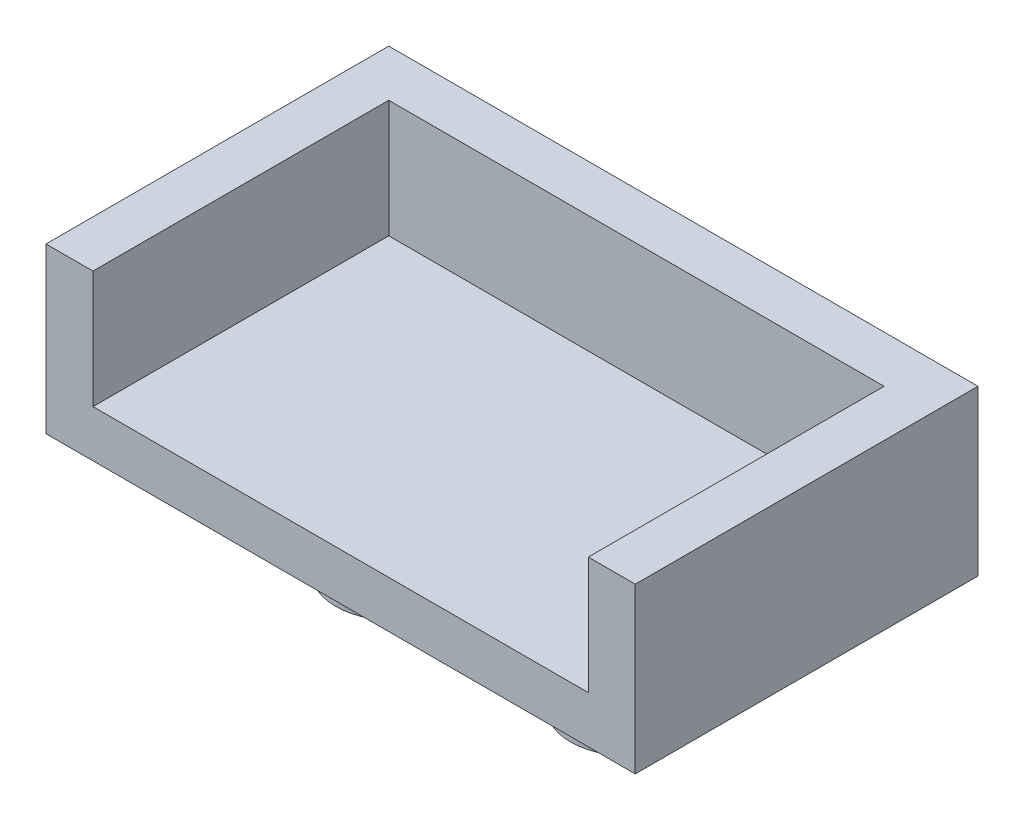
ISO-10303-21;
HEADER;
FILE_DESCRIPTION(('STEP AP214'),'2;1');
FILE_NAME('part.step','',(''),(''),'','','');
FILE_SCHEMA(('AUTOMOTIVE_DESIGN { 1 0 10303 214 1 1 1 1 }'));
ENDSEC;
DATA;
#1=APPLICATION_CONTEXT('core data for automotive mechanical design processes');
#2=APPLICATION_PROTOCOL_DEFINITION('international standard','automotive_design',2000,#1);
#3=PRODUCT_CONTEXT('',#1,'mechanical');
#4=PRODUCT('Part','Part','',(#3));
#5=PRODUCT_RELATED_PRODUCT_CATEGORY('part','',(#4));
#6=PRODUCT_DEFINITION_FORMATION('','',#4);
#7=PRODUCT_DEFINITION_CONTEXT('part definition',#1,'design');
#8=PRODUCT_DEFINITION('design','',#6,#7);
#9=PRODUCT_DEFINITION_SHAPE('','',#8);
#10=(LENGTH_UNIT() NAMED_UNIT(*) SI_UNIT(.MILLI.,.METRE.));
#11=(NAMED_UNIT(*) PLANE_ANGLE_UNIT() SI_UNIT($,.RADIAN.));
#12=(NAMED_UNIT(*) SI_UNIT($,.STERADIAN.) SOLID_ANGLE_UNIT());
#13=UNCERTAINTY_MEASURE_WITH_UNIT(LENGTH_MEASURE(1.E-05),#10,'distance_accuracy_value','');
#14=(GEOMETRIC_REPRESENTATION_CONTEXT(3) GLOBAL_UNCERTAINTY_ASSIGNED_CONTEXT((#13)) GLOBAL_UNIT_ASSIGNED_CONTEXT((#10,
#11,#12)) REPRESENTATION_CONTEXT('',''));
#15=CARTESIAN_POINT('',(0.,0.,0.));
#16=DIRECTION('',(0.,0.,1.));
#17=DIRECTION('',(1.,0.,0.));
#18=AXIS2_PLACEMENT_3D('',#15,#16,#17);
#19=CARTESIAN_POINT('',(21.1,5.,0.));
#20=DIRECTION('',(-1.,0.,0.));
#21=DIRECTION('',(0.,0.,1.));
#22=AXIS2_PLACEMENT_3D('',#19,#20,#21);
#23=PLANE('',#22);
#24=DIRECTION('',(0.,0.,-1.));
#25=VECTOR('',#24,1.);
#26=CARTESIAN_POINT('',(21.1,0.,0.));
#27=LINE('',#26,#25);
#28=CARTESIAN_POINT('',(21.1,0.,0.));
#29=VERTEX_POINT('',#28);
#30=CARTESIAN_POINT('',(21.1,0.,-12.6));
#31=VERTEX_POINT('',#30);
#32=EDGE_CURVE('E151',#29,#31,#27,.T.);
#33=ORIENTED_EDGE('',*,*,#32,.F.);
#34=DIRECTION('',(0.,-1.,0.));
#35=VECTOR('',#34,1.);
#36=CARTESIAN_POINT('',(21.1,5.,0.));
#37=LINE('',#36,#35);
#38=CARTESIAN_POINT('',(21.1,5.,0.));
#39=VERTEX_POINT('',#38);
#40=EDGE_CURVE('E121',#39,#29,#37,.T.);
#41=ORIENTED_EDGE('',*,*,#40,.F.);
#42=DIRECTION('',(0.,0.,-1.));
#43=VECTOR('',#42,1.);
#44=CARTESIAN_POINT('',(21.1,5.,0.));
#45=LINE('',#44,#43);
#46=CARTESIAN_POINT('',(21.1,5.,-12.6));
#47=VERTEX_POINT('',#46);
#48=EDGE_CURVE('E153',#39,#47,#45,.T.);
#49=ORIENTED_EDGE('',*,*,#48,.T.);
#50=DIRECTION('',(0.,-1.,0.));
#51=VECTOR('',#50,1.);
#52=CARTESIAN_POINT('',(21.1,5.,-12.6));
#53=LINE('',#52,#51);
#54=EDGE_CURVE('E179',#47,#31,#53,.T.);
#55=ORIENTED_EDGE('',*,*,#54,.T.);
#56=EDGE_LOOP('',(#33,#41,#49,#55));
#57=FACE_BOUND('',#56,.T.);
#58=ADVANCED_FACE('F49',(#57),#23,.T.);
#59=CARTESIAN_POINT('',(23.1,5.,0.));
#60=DIRECTION('',(-1.,0.,0.));
#61=DIRECTION('',(0.,0.,1.));
#62=AXIS2_PLACEMENT_3D('',#59,#60,#61);
#63=PLANE('',#62);
#64=DIRECTION('',(0.,-1.,0.));
#65=VECTOR('',#64,1.);
#66=CARTESIAN_POINT('',(23.1,5.,0.));
#67=LINE('',#66,#65);
#68=CARTESIAN_POINT('',(23.1,5.,0.));
#69=VERTEX_POINT('',#68);
#70=CARTESIAN_POINT('',(23.1,-2.,0.));
#71=VERTEX_POINT('',#70);
#72=EDGE_CURVE('E111',#69,#71,#67,.T.);
#73=ORIENTED_EDGE('',*,*,#72,.T.);
#74=DIRECTION('',(0.,0.,-1.));
#75=VECTOR('',#74,1.);
#76=CARTESIAN_POINT('',(23.1,-2.,0.));
#77=LINE('',#76,#75);
#78=CARTESIAN_POINT('',(23.1,-2.,-14.6));
#79=VERTEX_POINT('',#78);
#80=EDGE_CURVE('E115',#71,#79,#77,.T.);
#81=ORIENTED_EDGE('',*,*,#80,.T.);
#82=DIRECTION('',(0.,-1.,0.));
#83=VECTOR('',#82,1.);
#84=CARTESIAN_POINT('',(23.1,5.,-14.6));
#85=LINE('',#84,#83);
#86=CARTESIAN_POINT('',(23.1,5.,-14.6));
#87=VERTEX_POINT('',#86);
#88=EDGE_CURVE('E122',#87,#79,#85,.T.);
#89=ORIENTED_EDGE('',*,*,#88,.F.);
#90=DIRECTION('',(0.,0.,-1.));
#91=VECTOR('',#90,1.);
#92=CARTESIAN_POINT('',(23.1,5.,0.));
#93=LINE('',#92,#91);
#94=EDGE_CURVE('E116',#69,#87,#93,.T.);
#95=ORIENTED_EDGE('',*,*,#94,.F.);
#96=EDGE_LOOP('',(#73,#81,#89,#95));
#97=FACE_BOUND('',#96,.T.);
#98=ADVANCED_FACE('F113',(#97),#63,.F.);
#99=CARTESIAN_POINT('',(0.,5.,-14.6));
#100=DIRECTION('',(0.,0.,-1.));
#101=DIRECTION('',(-1.,0.,0.));
#102=AXIS2_PLACEMENT_3D('',#99,#100,#101);
#103=PLANE('',#102);
#104=ORIENTED_EDGE('',*,*,#88,.T.);
#105=DIRECTION('',(1.,0.,0.));
#106=VECTOR('',#105,1.);
#107=CARTESIAN_POINT('',(0.,-2.,-14.6));
#108=LINE('',#107,#106);
#109=CARTESIAN_POINT('',(-2.,-2.,-14.6));
#110=VERTEX_POINT('',#109);
#111=EDGE_CURVE('E131',#110,#79,#108,.T.);
#112=ORIENTED_EDGE('',*,*,#111,.F.);
#113=DIRECTION('',(0.,-1.,0.));
#114=VECTOR('',#113,1.);
#115=CARTESIAN_POINT('',(-2.,5.,-14.6));
#116=LINE('',#115,#114);
#117=CARTESIAN_POINT('',(-2.,5.,-14.6));
#118=VERTEX_POINT('',#117);
#119=EDGE_CURVE('E202',#118,#110,#116,.T.);
#120=ORIENTED_EDGE('',*,*,#119,.F.);
#121=DIRECTION('',(1.,0.,0.));
#122=VECTOR('',#121,1.);
#123=CARTESIAN_POINT('',(0.,5.,-14.6));
#124=LINE('',#123,#122);
#125=EDGE_CURVE('E163',#118,#87,#124,.T.);
#126=ORIENTED_EDGE('',*,*,#125,.T.);
#127=EDGE_LOOP('',(#104,#112,#120,#126));
#128=FACE_BOUND('',#127,.T.);
#129=ADVANCED_FACE('F236',(#128),#103,.T.);
#130=CARTESIAN_POINT('',(-2.,5.,0.));
#131=DIRECTION('',(-1.,0.,0.));
#132=DIRECTION('',(0.,0.,1.));
#133=AXIS2_PLACEMENT_3D('',#130,#131,#132);
#134=PLANE('',#133);
#135=ORIENTED_EDGE('',*,*,#119,.T.);
#136=DIRECTION('',(0.,0.,-1.));
#137=VECTOR('',#136,1.);
#138=CARTESIAN_POINT('',(-2.,-2.,0.));
#139=LINE('',#138,#137);
#140=CARTESIAN_POINT('',(-2.,-2.,0.));
#141=VERTEX_POINT('',#140);
#142=EDGE_CURVE('E149',#141,#110,#139,.T.);
#143=ORIENTED_EDGE('',*,*,#142,.F.);
#144=DIRECTION('',(0.,-1.,0.));
#145=VECTOR('',#144,1.);
#146=CARTESIAN_POINT('',(-2.,5.,0.));
#147=LINE('',#146,#145);
#148=CARTESIAN_POINT('',(-2.,5.,0.));
#149=VERTEX_POINT('',#148);
#150=EDGE_CURVE('E136',#149,#141,#147,.T.);
#151=ORIENTED_EDGE('',*,*,#150,.F.);
#152=DIRECTION('',(0.,0.,-1.));
#153=VECTOR('',#152,1.);
#154=CARTESIAN_POINT('',(-2.,5.,0.));
#155=LINE('',#154,#153);
#156=EDGE_CURVE('E167',#149,#118,#155,.T.);
#157=ORIENTED_EDGE('',*,*,#156,.T.);
#158=EDGE_LOOP('',(#135,#143,#151,#157));
#159=FACE_BOUND('',#158,.T.);
#160=ADVANCED_FACE('F245',(#159),#134,.T.);
#161=CARTESIAN_POINT('',(0.,5.,0.));
#162=DIRECTION('',(0.,0.,-1.));
#163=DIRECTION('',(-1.,0.,0.));
#164=AXIS2_PLACEMENT_3D('',#161,#162,#163);
#165=PLANE('',#164);
#166=ORIENTED_EDGE('',*,*,#150,.T.);
#167=DIRECTION('',(1.,0.,0.));
#168=VECTOR('',#167,1.);
#169=CARTESIAN_POINT('',(0.,-2.,0.));
#170=LINE('',#169,#168);
#171=EDGE_CURVE('E129',#141,#71,#170,.T.);
#172=ORIENTED_EDGE('',*,*,#171,.T.);
#173=ORIENTED_EDGE('',*,*,#72,.F.);
#174=DIRECTION('',(1.,0.,0.));
#175=VECTOR('',#174,1.);
#176=CARTESIAN_POINT('',(0.,5.,0.));
#177=LINE('',#176,#175);
#178=EDGE_CURVE('E157',#39,#69,#177,.T.);
#179=ORIENTED_EDGE('',*,*,#178,.F.);
#180=ORIENTED_EDGE('',*,*,#40,.T.);
#181=DIRECTION('',(1.,0.,0.));
#182=VECTOR('',#181,1.);
#183=CARTESIAN_POINT('',(0.,0.,0.));
#184=LINE('',#183,#182);
#185=CARTESIAN_POINT('',(0.,0.,0.));
#186=VERTEX_POINT('',#185);
#187=EDGE_CURVE('E139',#186,#29,#184,.T.);
#188=ORIENTED_EDGE('',*,*,#187,.F.);
#189=DIRECTION('',(0.,-1.,0.));
#190=VECTOR('',#189,1.);
#191=CARTESIAN_POINT('',(0.,5.,0.));
#192=LINE('',#191,#190);
#193=CARTESIAN_POINT('',(0.,5.,0.));
#194=VERTEX_POINT('',#193);
#195=EDGE_CURVE('E196',#194,#186,#192,.T.);
#196=ORIENTED_EDGE('',*,*,#195,.F.);
#197=DIRECTION('',(1.,0.,0.));
#198=VECTOR('',#197,1.);
#199=CARTESIAN_POINT('',(0.,5.,0.));
#200=LINE('',#199,#198);
#201=EDGE_CURVE('E171',#149,#194,#200,.T.);
#202=ORIENTED_EDGE('',*,*,#201,.F.);
#203=EDGE_LOOP('',(#166,#172,#173,#179,#180,#188,#196,#202));
#204=FACE_BOUND('',#203,.T.);
#205=ADVANCED_FACE('F134',(#204),#165,.F.);
#206=CARTESIAN_POINT('',(0.,5.,0.));
#207=DIRECTION('',(-1.,0.,0.));
#208=DIRECTION('',(0.,0.,1.));
#209=AXIS2_PLACEMENT_3D('',#206,#207,#208);
#210=PLANE('',#209);
#211=DIRECTION('',(0.,0.,-1.));
#212=VECTOR('',#211,1.);
#213=CARTESIAN_POINT('',(0.,0.,0.));
#214=LINE('',#213,#212);
#215=CARTESIAN_POINT('',(0.,0.,-12.6));
#216=VERTEX_POINT('',#215);
#217=EDGE_CURVE('E182',#186,#216,#214,.T.);
#218=ORIENTED_EDGE('',*,*,#217,.T.);
#219=DIRECTION('',(0.,-1.,0.));
#220=VECTOR('',#219,1.);
#221=CARTESIAN_POINT('',(0.,5.,-12.6));
#222=LINE('',#221,#220);
#223=CARTESIAN_POINT('',(0.,5.,-12.6));
#224=VERTEX_POINT('',#223);
#225=EDGE_CURVE('E192',#224,#216,#222,.T.);
#226=ORIENTED_EDGE('',*,*,#225,.F.);
#227=DIRECTION('',(0.,0.,-1.));
#228=VECTOR('',#227,1.);
#229=CARTESIAN_POINT('',(0.,5.,0.));
#230=LINE('',#229,#228);
#231=EDGE_CURVE('E174',#194,#224,#230,.T.);
#232=ORIENTED_EDGE('',*,*,#231,.F.);
#233=ORIENTED_EDGE('',*,*,#195,.T.);
#234=EDGE_LOOP('',(#218,#226,#232,#233));
#235=FACE_BOUND('',#234,.T.);
#236=ADVANCED_FACE('F249',(#235),#210,.F.);
#237=CARTESIAN_POINT('',(0.,5.,-12.6));
#238=DIRECTION('',(0.,0.,-1.));
#239=DIRECTION('',(-1.,0.,0.));
#240=AXIS2_PLACEMENT_3D('',#237,#238,#239);
#241=PLANE('',#240);
#242=DIRECTION('',(1.,0.,0.));
#243=VECTOR('',#242,1.);
#244=CARTESIAN_POINT('',(0.,0.,-12.6));
#245=LINE('',#244,#243);
#246=EDGE_CURVE('E158',#216,#31,#245,.T.);
#247=ORIENTED_EDGE('',*,*,#246,.T.);
#248=ORIENTED_EDGE('',*,*,#54,.F.);
#249=DIRECTION('',(1.,0.,0.));
#250=VECTOR('',#249,1.);
#251=CARTESIAN_POINT('',(0.,5.,-12.6));
#252=LINE('',#251,#250);
#253=EDGE_CURVE('E65',#224,#47,#252,.T.);
#254=ORIENTED_EDGE('',*,*,#253,.F.);
#255=ORIENTED_EDGE('',*,*,#225,.T.);
#256=EDGE_LOOP('',(#247,#248,#254,#255));
#257=FACE_BOUND('',#256,.T.);
#258=ADVANCED_FACE('F227',(#257),#241,.F.);
#259=CARTESIAN_POINT('',(0.,5.,0.));
#260=DIRECTION('',(0.,1.,0.));
#261=DIRECTION('',(0.,0.,1.));
#262=AXIS2_PLACEMENT_3D('',#259,#260,#261);
#263=PLANE('',#262);
#264=ORIENTED_EDGE('',*,*,#48,.F.);
#265=ORIENTED_EDGE('',*,*,#178,.T.);
#266=ORIENTED_EDGE('',*,*,#94,.T.);
#267=ORIENTED_EDGE('',*,*,#125,.F.);
#268=ORIENTED_EDGE('',*,*,#156,.F.);
#269=ORIENTED_EDGE('',*,*,#201,.T.);
#270=ORIENTED_EDGE('',*,*,#231,.T.);
#271=ORIENTED_EDGE('',*,*,#253,.T.);
#272=EDGE_LOOP('',(#264,#265,#266,#267,#268,#269,#270,#271));
#273=FACE_BOUND('',#272,.T.);
#274=ADVANCED_FACE('F217',(#273),#263,.T.);
#275=CARTESIAN_POINT('',(0.,-2.,0.));
#276=DIRECTION('',(0.,1.,0.));
#277=DIRECTION('',(0.,0.,1.));
#278=AXIS2_PLACEMENT_3D('',#275,#276,#277);
#279=PLANE('',#278);
#280=CARTESIAN_POINT('',(15.55,-2.,-7.3));
#281=DIRECTION('',(0.,1.,0.));
#282=DIRECTION('',(0.,0.,1.));
#283=AXIS2_PLACEMENT_3D('',#280,#281,#282);
#284=CIRCLE('',#283,2.5);
#285=CARTESIAN_POINT('',(15.55,-2.,-4.8));
#286=VERTEX_POINT('',#285);
#287=EDGE_CURVE('E11',#286,#286,#284,.F.);
#288=ORIENTED_EDGE('',*,*,#287,.F.);
#289=EDGE_LOOP('',(#288));
#290=FACE_BOUND('',#289,.T.);
#291=CARTESIAN_POINT('',(5.55,-2.,-7.3));
#292=DIRECTION('',(0.,1.,0.));
#293=DIRECTION('',(0.,0.,1.));
#294=AXIS2_PLACEMENT_3D('',#291,#292,#293);
#295=CIRCLE('',#294,2.5);
#296=CARTESIAN_POINT('',(5.55,-2.,-4.8));
#297=VERTEX_POINT('',#296);
#298=EDGE_CURVE('E58',#297,#297,#295,.F.);
#299=ORIENTED_EDGE('',*,*,#298,.F.);
#300=EDGE_LOOP('',(#299));
#301=FACE_BOUND('',#300,.T.);
#302=ORIENTED_EDGE('',*,*,#171,.F.);
#303=ORIENTED_EDGE('',*,*,#142,.T.);
#304=ORIENTED_EDGE('',*,*,#111,.T.);
#305=ORIENTED_EDGE('',*,*,#80,.F.);
#306=EDGE_LOOP('',(#302,#303,#304,#305));
#307=FACE_BOUND('',#306,.T.);
#308=ADVANCED_FACE('F127',(#290,#301,#307),#279,.F.);
#309=CARTESIAN_POINT('',(0.,0.,0.));
#310=DIRECTION('',(0.,1.,0.));
#311=DIRECTION('',(0.,0.,1.));
#312=AXIS2_PLACEMENT_3D('',#309,#310,#311);
#313=PLANE('',#312);
#314=ORIENTED_EDGE('',*,*,#187,.T.);
#315=ORIENTED_EDGE('',*,*,#32,.T.);
#316=ORIENTED_EDGE('',*,*,#246,.F.);
#317=ORIENTED_EDGE('',*,*,#217,.F.);
#318=EDGE_LOOP('',(#314,#315,#316,#317));
#319=FACE_BOUND('',#318,.T.);
#320=ADVANCED_FACE('F216',(#319),#313,.T.);
#321=CARTESIAN_POINT('',(5.55,-7.,-7.3));
#322=DIRECTION('',(0.,1.,0.));
#323=DIRECTION('',(0.,0.,1.));
#324=AXIS2_PLACEMENT_3D('',#321,#322,#323);
#325=CYLINDRICAL_SURFACE('',#324,2.5);
#326=CARTESIAN_POINT('',(5.55,-7.,-7.3));
#327=DIRECTION('',(0.,-1.,0.));
#328=DIRECTION('',(0.,0.,-1.));
#329=AXIS2_PLACEMENT_3D('',#326,#327,#328);
#330=CIRCLE('',#329,2.5);
#331=CARTESIAN_POINT('',(5.55,-7.,-9.8));
#332=VERTEX_POINT('',#331);
#333=EDGE_CURVE('E142',#332,#332,#330,.T.);
#334=ORIENTED_EDGE('',*,*,#333,.F.);
#335=EDGE_LOOP('',(#334));
#336=FACE_BOUND('',#335,.T.);
#337=ORIENTED_EDGE('',*,*,#298,.T.);
#338=EDGE_LOOP('',(#337));
#339=FACE_BOUND('',#338,.T.);
#340=ADVANCED_FACE('F213',(#336,#339),#325,.T.);
#341=CARTESIAN_POINT('',(5.55,-7.,-7.3));
#342=DIRECTION('',(0.,-1.,0.));
#343=DIRECTION('',(0.,0.,-1.));
#344=AXIS2_PLACEMENT_3D('',#341,#342,#343);
#345=PLANE('',#344);
#346=ORIENTED_EDGE('',*,*,#333,.T.);
#347=EDGE_LOOP('',(#346));
#348=FACE_BOUND('',#347,.T.);
#349=ADVANCED_FACE('F343',(#348),#345,.T.);
#350=CARTESIAN_POINT('',(15.55,-7.,-7.3));
#351=DIRECTION('',(0.,1.,0.));
#352=DIRECTION('',(0.,0.,1.));
#353=AXIS2_PLACEMENT_3D('',#350,#351,#352);
#354=CYLINDRICAL_SURFACE('',#353,2.5);
#355=CARTESIAN_POINT('',(15.55,-7.,-7.3));
#356=DIRECTION('',(0.,-1.,0.));
#357=DIRECTION('',(0.,0.,1.));
#358=AXIS2_PLACEMENT_3D('',#355,#356,#357);
#359=CIRCLE('',#358,2.5);
#360=CARTESIAN_POINT('',(15.55,-7.,-4.8));
#361=VERTEX_POINT('',#360);
#362=EDGE_CURVE('E378',#361,#361,#359,.T.);
#363=ORIENTED_EDGE('',*,*,#362,.F.);
#364=EDGE_LOOP('',(#363));
#365=FACE_BOUND('',#364,.T.);
#366=ORIENTED_EDGE('',*,*,#287,.T.);
#367=EDGE_LOOP('',(#366));
#368=FACE_BOUND('',#367,.T.);
#369=ADVANCED_FACE('F351',(#365,#368),#354,.T.);
#370=CARTESIAN_POINT('',(15.55,-7.,-7.3));
#371=DIRECTION('',(0.,1.,0.));
#372=DIRECTION('',(0.,0.,1.));
#373=AXIS2_PLACEMENT_3D('',#370,#371,#372);
#374=PLANE('',#373);
#375=ORIENTED_EDGE('',*,*,#362,.T.);
#376=EDGE_LOOP('',(#375));
#377=FACE_BOUND('',#376,.T.);
#378=ADVANCED_FACE('F360',(#377),#374,.F.);
#379=CLOSED_SHELL('',(#58,#98,#129,#160,#205,#236,#258,#274,#308,#320,#340,#349,#369,#378));
#380=MANIFOLD_SOLID_BREP('B2',#379);
#381=ADVANCED_BREP_SHAPE_REPRESENTATION('',(#18,#380),#14);
#382=SHAPE_DEFINITION_REPRESENTATION(#9,#381);
ENDSEC;
END-ISO-10303-21;
